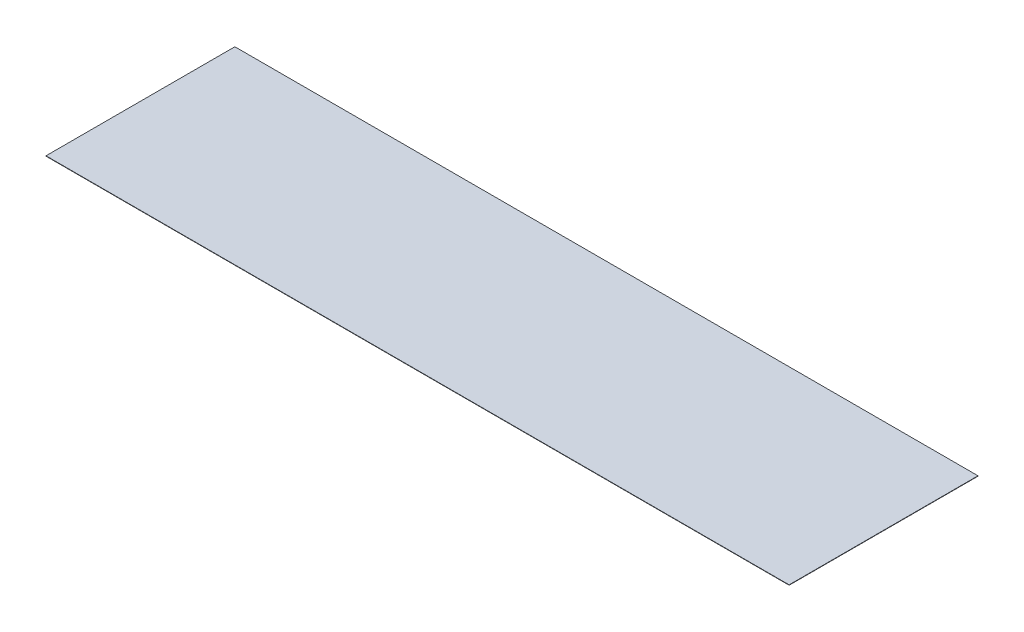
ISO-10303-21;
HEADER;
FILE_DESCRIPTION(('STEP AP214'),'2;1');
FILE_NAME('part.step','',(''),(''),'','','');
FILE_SCHEMA(('AUTOMOTIVE_DESIGN { 1 0 10303 214 1 1 1 1 }'));
ENDSEC;
DATA;
#1=APPLICATION_CONTEXT('core data for automotive mechanical design processes');
#2=APPLICATION_PROTOCOL_DEFINITION('international standard','automotive_design',2000,#1);
#3=PRODUCT_CONTEXT('',#1,'mechanical');
#4=PRODUCT('Part','Part','',(#3));
#5=PRODUCT_RELATED_PRODUCT_CATEGORY('part','',(#4));
#6=PRODUCT_DEFINITION_FORMATION('','',#4);
#7=PRODUCT_DEFINITION_CONTEXT('part definition',#1,'design');
#8=PRODUCT_DEFINITION('design','',#6,#7);
#9=PRODUCT_DEFINITION_SHAPE('','',#8);
#10=(LENGTH_UNIT() NAMED_UNIT(*) SI_UNIT(.MILLI.,.METRE.));
#11=(NAMED_UNIT(*) PLANE_ANGLE_UNIT() SI_UNIT($,.RADIAN.));
#12=(NAMED_UNIT(*) SI_UNIT($,.STERADIAN.) SOLID_ANGLE_UNIT());
#13=UNCERTAINTY_MEASURE_WITH_UNIT(LENGTH_MEASURE(1.E-05),#10,'distance_accuracy_value','');
#14=(GEOMETRIC_REPRESENTATION_CONTEXT(3) GLOBAL_UNCERTAINTY_ASSIGNED_CONTEXT((#13)) GLOBAL_UNIT_ASSIGNED_CONTEXT((#10,
#11,#12)) REPRESENTATION_CONTEXT('',''));
#15=CARTESIAN_POINT('',(0.,0.,0.));
#16=DIRECTION('',(0.,0.,1.));
#17=DIRECTION('',(1.,0.,0.));
#18=AXIS2_PLACEMENT_3D('',#15,#16,#17);
#19=CARTESIAN_POINT('',(-162.5,0.16,41.3));
#20=DIRECTION('',(1.,0.,0.));
#21=DIRECTION('',(0.,0.,-1.));
#22=AXIS2_PLACEMENT_3D('',#19,#20,#21);
#23=PLANE('',#22);
#24=DIRECTION('',(0.,0.,1.));
#25=VECTOR('',#24,1.);
#26=CARTESIAN_POINT('',(-162.5,0.,41.3));
#27=LINE('',#26,#25);
#28=CARTESIAN_POINT('',(-162.5,0.,-41.3));
#29=VERTEX_POINT('',#28);
#30=CARTESIAN_POINT('',(-162.5,0.,41.3));
#31=VERTEX_POINT('',#30);
#32=EDGE_CURVE('E96',#29,#31,#27,.T.);
#33=ORIENTED_EDGE('',*,*,#32,.T.);
#34=DIRECTION('',(0.,-1.,0.));
#35=VECTOR('',#34,1.);
#36=CARTESIAN_POINT('',(-162.5,0.16,41.3));
#37=LINE('',#36,#35);
#38=CARTESIAN_POINT('',(-162.5,0.16,41.3));
#39=VERTEX_POINT('',#38);
#40=EDGE_CURVE('E11',#39,#31,#37,.T.);
#41=ORIENTED_EDGE('',*,*,#40,.F.);
#42=DIRECTION('',(0.,0.,1.));
#43=VECTOR('',#42,1.);
#44=CARTESIAN_POINT('',(-162.5,0.16,41.3));
#45=LINE('',#44,#43);
#46=CARTESIAN_POINT('',(-162.5,0.16,-41.3));
#47=VERTEX_POINT('',#46);
#48=EDGE_CURVE('E84',#47,#39,#45,.T.);
#49=ORIENTED_EDGE('',*,*,#48,.F.);
#50=DIRECTION('',(0.,-1.,0.));
#51=VECTOR('',#50,1.);
#52=CARTESIAN_POINT('',(-162.5,0.16,-41.3));
#53=LINE('',#52,#51);
#54=EDGE_CURVE('E92',#47,#29,#53,.T.);
#55=ORIENTED_EDGE('',*,*,#54,.T.);
#56=EDGE_LOOP('',(#33,#41,#49,#55));
#57=FACE_BOUND('',#56,.T.);
#58=ADVANCED_FACE('F33',(#57),#23,.F.);
#59=CARTESIAN_POINT('',(162.5,0.16,41.3));
#60=DIRECTION('',(0.,0.,-1.));
#61=DIRECTION('',(-1.,0.,0.));
#62=AXIS2_PLACEMENT_3D('',#59,#60,#61);
#63=PLANE('',#62);
#64=DIRECTION('',(1.,0.,0.));
#65=VECTOR('',#64,1.);
#66=CARTESIAN_POINT('',(162.5,0.,41.3));
#67=LINE('',#66,#65);
#68=CARTESIAN_POINT('',(162.5,0.,41.3));
#69=VERTEX_POINT('',#68);
#70=EDGE_CURVE('E88',#31,#69,#67,.T.);
#71=ORIENTED_EDGE('',*,*,#70,.T.);
#72=DIRECTION('',(0.,-1.,0.));
#73=VECTOR('',#72,1.);
#74=CARTESIAN_POINT('',(162.5,0.16,41.3));
#75=LINE('',#74,#73);
#76=CARTESIAN_POINT('',(162.5,0.16,41.3));
#77=VERTEX_POINT('',#76);
#78=EDGE_CURVE('E41',#77,#69,#75,.T.);
#79=ORIENTED_EDGE('',*,*,#78,.F.);
#80=DIRECTION('',(1.,0.,0.));
#81=VECTOR('',#80,1.);
#82=CARTESIAN_POINT('',(162.5,0.16,41.3));
#83=LINE('',#82,#81);
#84=EDGE_CURVE('E79',#39,#77,#83,.T.);
#85=ORIENTED_EDGE('',*,*,#84,.F.);
#86=ORIENTED_EDGE('',*,*,#40,.T.);
#87=EDGE_LOOP('',(#71,#79,#85,#86));
#88=FACE_BOUND('',#87,.T.);
#89=ADVANCED_FACE('F87',(#88),#63,.F.);
#90=CARTESIAN_POINT('',(162.5,0.16,41.3));
#91=DIRECTION('',(-1.,0.,0.));
#92=DIRECTION('',(0.,0.,1.));
#93=AXIS2_PLACEMENT_3D('',#90,#91,#92);
#94=PLANE('',#93);
#95=DIRECTION('',(0.,0.,-1.));
#96=VECTOR('',#95,1.);
#97=CARTESIAN_POINT('',(162.5,0.,41.3));
#98=LINE('',#97,#96);
#99=CARTESIAN_POINT('',(162.5,0.,-41.3));
#100=VERTEX_POINT('',#99);
#101=EDGE_CURVE('E66',#69,#100,#98,.T.);
#102=ORIENTED_EDGE('',*,*,#101,.T.);
#103=DIRECTION('',(0.,-1.,0.));
#104=VECTOR('',#103,1.);
#105=CARTESIAN_POINT('',(162.5,0.16,-41.3));
#106=LINE('',#105,#104);
#107=CARTESIAN_POINT('',(162.5,0.16,-41.3));
#108=VERTEX_POINT('',#107);
#109=EDGE_CURVE('E89',#108,#100,#106,.T.);
#110=ORIENTED_EDGE('',*,*,#109,.F.);
#111=DIRECTION('',(0.,0.,-1.));
#112=VECTOR('',#111,1.);
#113=CARTESIAN_POINT('',(162.5,0.16,41.3));
#114=LINE('',#113,#112);
#115=EDGE_CURVE('E82',#77,#108,#114,.T.);
#116=ORIENTED_EDGE('',*,*,#115,.F.);
#117=ORIENTED_EDGE('',*,*,#78,.T.);
#118=EDGE_LOOP('',(#102,#110,#116,#117));
#119=FACE_BOUND('',#118,.T.);
#120=ADVANCED_FACE('F90',(#119),#94,.F.);
#121=CARTESIAN_POINT('',(162.5,0.16,-41.3));
#122=DIRECTION('',(0.,0.,1.));
#123=DIRECTION('',(1.,0.,0.));
#124=AXIS2_PLACEMENT_3D('',#121,#122,#123);
#125=PLANE('',#124);
#126=DIRECTION('',(-1.,0.,0.));
#127=VECTOR('',#126,1.);
#128=CARTESIAN_POINT('',(162.5,0.,-41.3));
#129=LINE('',#128,#127);
#130=EDGE_CURVE('E72',#100,#29,#129,.T.);
#131=ORIENTED_EDGE('',*,*,#130,.T.);
#132=ORIENTED_EDGE('',*,*,#54,.F.);
#133=DIRECTION('',(-1.,0.,0.));
#134=VECTOR('',#133,1.);
#135=CARTESIAN_POINT('',(162.5,0.16,-41.3));
#136=LINE('',#135,#134);
#137=EDGE_CURVE('E49',#108,#47,#136,.T.);
#138=ORIENTED_EDGE('',*,*,#137,.F.);
#139=ORIENTED_EDGE('',*,*,#109,.T.);
#140=EDGE_LOOP('',(#131,#132,#138,#139));
#141=FACE_BOUND('',#140,.T.);
#142=ADVANCED_FACE('F103',(#141),#125,.F.);
#143=CARTESIAN_POINT('',(0.,0.16,0.));
#144=DIRECTION('',(0.,1.,0.));
#145=DIRECTION('',(0.,0.,1.));
#146=AXIS2_PLACEMENT_3D('',#143,#144,#145);
#147=PLANE('',#146);
#148=ORIENTED_EDGE('',*,*,#48,.T.);
#149=ORIENTED_EDGE('',*,*,#84,.T.);
#150=ORIENTED_EDGE('',*,*,#115,.T.);
#151=ORIENTED_EDGE('',*,*,#137,.T.);
#152=EDGE_LOOP('',(#148,#149,#150,#151));
#153=FACE_BOUND('',#152,.T.);
#154=ADVANCED_FACE('F80',(#153),#147,.T.);
#155=CARTESIAN_POINT('',(0.,0.,0.));
#156=DIRECTION('',(0.,1.,0.));
#157=DIRECTION('',(0.,0.,1.));
#158=AXIS2_PLACEMENT_3D('',#155,#156,#157);
#159=PLANE('',#158);
#160=ORIENTED_EDGE('',*,*,#32,.F.);
#161=ORIENTED_EDGE('',*,*,#130,.F.);
#162=ORIENTED_EDGE('',*,*,#101,.F.);
#163=ORIENTED_EDGE('',*,*,#70,.F.);
#164=EDGE_LOOP('',(#160,#161,#162,#163));
#165=FACE_BOUND('',#164,.T.);
#166=ADVANCED_FACE('F106',(#165),#159,.F.);
#167=CLOSED_SHELL('',(#58,#89,#120,#142,#154,#166));
#168=MANIFOLD_SOLID_BREP('B2',#167);
#169=ADVANCED_BREP_SHAPE_REPRESENTATION('',(#18,#168),#14);
#170=SHAPE_DEFINITION_REPRESENTATION(#9,#169);
ENDSEC;
END-ISO-10303-21;
